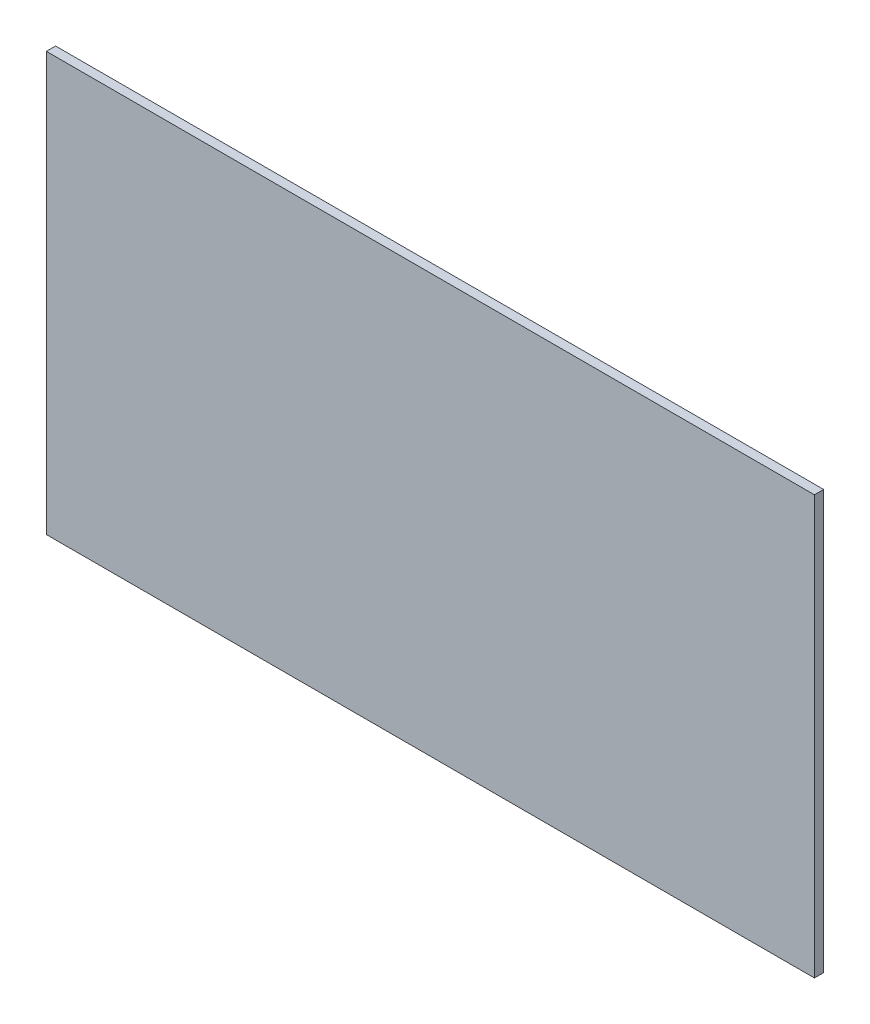
ISO-10303-21;
HEADER;
FILE_DESCRIPTION(('STEP AP214'),'2;1');
FILE_NAME('part.step','',(''),(''),'','','');
FILE_SCHEMA(('AUTOMOTIVE_DESIGN { 1 0 10303 214 1 1 1 1 }'));
ENDSEC;
DATA;
#1=APPLICATION_CONTEXT('core data for automotive mechanical design processes');
#2=APPLICATION_PROTOCOL_DEFINITION('international standard','automotive_design',2000,#1);
#3=PRODUCT_CONTEXT('',#1,'mechanical');
#4=PRODUCT('Part','Part','',(#3));
#5=PRODUCT_RELATED_PRODUCT_CATEGORY('part','',(#4));
#6=PRODUCT_DEFINITION_FORMATION('','',#4);
#7=PRODUCT_DEFINITION_CONTEXT('part definition',#1,'design');
#8=PRODUCT_DEFINITION('design','',#6,#7);
#9=PRODUCT_DEFINITION_SHAPE('','',#8);
#10=(LENGTH_UNIT() NAMED_UNIT(*) SI_UNIT(.MILLI.,.METRE.));
#11=(NAMED_UNIT(*) PLANE_ANGLE_UNIT() SI_UNIT($,.RADIAN.));
#12=(NAMED_UNIT(*) SI_UNIT($,.STERADIAN.) SOLID_ANGLE_UNIT());
#13=UNCERTAINTY_MEASURE_WITH_UNIT(LENGTH_MEASURE(1.E-05),#10,'distance_accuracy_value','');
#14=(GEOMETRIC_REPRESENTATION_CONTEXT(3) GLOBAL_UNCERTAINTY_ASSIGNED_CONTEXT((#13)) GLOBAL_UNIT_ASSIGNED_CONTEXT((#10,
#11,#12)) REPRESENTATION_CONTEXT('',''));
#15=CARTESIAN_POINT('',(0.,0.,0.));
#16=DIRECTION('',(0.,0.,1.));
#17=DIRECTION('',(1.,0.,0.));
#18=AXIS2_PLACEMENT_3D('',#15,#16,#17);
#19=CARTESIAN_POINT('',(0.,0.,1.68));
#20=DIRECTION('',(1.,0.,0.));
#21=DIRECTION('',(0.,0.,-1.));
#22=AXIS2_PLACEMENT_3D('',#19,#20,#21);
#23=PLANE('',#22);
#24=DIRECTION('',(0.,-1.,0.));
#25=VECTOR('',#24,1.);
#26=CARTESIAN_POINT('',(0.,0.,0.));
#27=LINE('',#26,#25);
#28=CARTESIAN_POINT('',(0.,76.28,0.));
#29=VERTEX_POINT('',#28);
#30=CARTESIAN_POINT('',(0.,0.,0.));
#31=VERTEX_POINT('',#30);
#32=EDGE_CURVE('E97',#29,#31,#27,.T.);
#33=ORIENTED_EDGE('',*,*,#32,.T.);
#34=DIRECTION('',(0.,0.,-1.));
#35=VECTOR('',#34,1.);
#36=CARTESIAN_POINT('',(0.,0.,1.68));
#37=LINE('',#36,#35);
#38=CARTESIAN_POINT('',(0.,0.,1.68));
#39=VERTEX_POINT('',#38);
#40=EDGE_CURVE('E11',#39,#31,#37,.T.);
#41=ORIENTED_EDGE('',*,*,#40,.F.);
#42=DIRECTION('',(0.,-1.,0.));
#43=VECTOR('',#42,1.);
#44=CARTESIAN_POINT('',(0.,0.,1.68));
#45=LINE('',#44,#43);
#46=CARTESIAN_POINT('',(0.,76.28,1.68));
#47=VERTEX_POINT('',#46);
#48=EDGE_CURVE('E85',#47,#39,#45,.T.);
#49=ORIENTED_EDGE('',*,*,#48,.F.);
#50=DIRECTION('',(0.,0.,-1.));
#51=VECTOR('',#50,1.);
#52=CARTESIAN_POINT('',(0.,76.28,1.68));
#53=LINE('',#52,#51);
#54=EDGE_CURVE('E93',#47,#29,#53,.T.);
#55=ORIENTED_EDGE('',*,*,#54,.T.);
#56=EDGE_LOOP('',(#33,#41,#49,#55));
#57=FACE_BOUND('',#56,.T.);
#58=ADVANCED_FACE('F34',(#57),#23,.F.);
#59=CARTESIAN_POINT('',(0.,0.,1.68));
#60=DIRECTION('',(0.,1.,0.));
#61=DIRECTION('',(0.,0.,1.));
#62=AXIS2_PLACEMENT_3D('',#59,#60,#61);
#63=PLANE('',#62);
#64=DIRECTION('',(1.,0.,0.));
#65=VECTOR('',#64,1.);
#66=CARTESIAN_POINT('',(0.,0.,0.));
#67=LINE('',#66,#65);
#68=CARTESIAN_POINT('',(140.,0.,0.));
#69=VERTEX_POINT('',#68);
#70=EDGE_CURVE('E89',#31,#69,#67,.T.);
#71=ORIENTED_EDGE('',*,*,#70,.T.);
#72=DIRECTION('',(0.,0.,-1.));
#73=VECTOR('',#72,1.);
#74=CARTESIAN_POINT('',(140.,0.,1.68));
#75=LINE('',#74,#73);
#76=CARTESIAN_POINT('',(140.,0.,1.68));
#77=VERTEX_POINT('',#76);
#78=EDGE_CURVE('E42',#77,#69,#75,.T.);
#79=ORIENTED_EDGE('',*,*,#78,.F.);
#80=DIRECTION('',(1.,0.,0.));
#81=VECTOR('',#80,1.);
#82=CARTESIAN_POINT('',(0.,0.,1.68));
#83=LINE('',#82,#81);
#84=EDGE_CURVE('E80',#39,#77,#83,.T.);
#85=ORIENTED_EDGE('',*,*,#84,.F.);
#86=ORIENTED_EDGE('',*,*,#40,.T.);
#87=EDGE_LOOP('',(#71,#79,#85,#86));
#88=FACE_BOUND('',#87,.T.);
#89=ADVANCED_FACE('F88',(#88),#63,.F.);
#90=CARTESIAN_POINT('',(140.,0.,1.68));
#91=DIRECTION('',(-1.,0.,0.));
#92=DIRECTION('',(0.,0.,1.));
#93=AXIS2_PLACEMENT_3D('',#90,#91,#92);
#94=PLANE('',#93);
#95=DIRECTION('',(0.,1.,0.));
#96=VECTOR('',#95,1.);
#97=CARTESIAN_POINT('',(140.,0.,0.));
#98=LINE('',#97,#96);
#99=CARTESIAN_POINT('',(140.,76.28,0.));
#100=VERTEX_POINT('',#99);
#101=EDGE_CURVE('E67',#69,#100,#98,.T.);
#102=ORIENTED_EDGE('',*,*,#101,.T.);
#103=DIRECTION('',(0.,0.,-1.));
#104=VECTOR('',#103,1.);
#105=CARTESIAN_POINT('',(140.,76.28,1.68));
#106=LINE('',#105,#104);
#107=CARTESIAN_POINT('',(140.,76.28,1.68));
#108=VERTEX_POINT('',#107);
#109=EDGE_CURVE('E90',#108,#100,#106,.T.);
#110=ORIENTED_EDGE('',*,*,#109,.F.);
#111=DIRECTION('',(0.,1.,0.));
#112=VECTOR('',#111,1.);
#113=CARTESIAN_POINT('',(140.,0.,1.68));
#114=LINE('',#113,#112);
#115=EDGE_CURVE('E83',#77,#108,#114,.T.);
#116=ORIENTED_EDGE('',*,*,#115,.F.);
#117=ORIENTED_EDGE('',*,*,#78,.T.);
#118=EDGE_LOOP('',(#102,#110,#116,#117));
#119=FACE_BOUND('',#118,.T.);
#120=ADVANCED_FACE('F91',(#119),#94,.F.);
#121=CARTESIAN_POINT('',(0.,76.28,1.68));
#122=DIRECTION('',(0.,-1.,0.));
#123=DIRECTION('',(0.,0.,-1.));
#124=AXIS2_PLACEMENT_3D('',#121,#122,#123);
#125=PLANE('',#124);
#126=DIRECTION('',(-1.,0.,0.));
#127=VECTOR('',#126,1.);
#128=CARTESIAN_POINT('',(0.,76.28,0.));
#129=LINE('',#128,#127);
#130=EDGE_CURVE('E73',#100,#29,#129,.T.);
#131=ORIENTED_EDGE('',*,*,#130,.T.);
#132=ORIENTED_EDGE('',*,*,#54,.F.);
#133=DIRECTION('',(-1.,0.,0.));
#134=VECTOR('',#133,1.);
#135=CARTESIAN_POINT('',(0.,76.28,1.68));
#136=LINE('',#135,#134);
#137=EDGE_CURVE('E50',#108,#47,#136,.T.);
#138=ORIENTED_EDGE('',*,*,#137,.F.);
#139=ORIENTED_EDGE('',*,*,#109,.T.);
#140=EDGE_LOOP('',(#131,#132,#138,#139));
#141=FACE_BOUND('',#140,.T.);
#142=ADVANCED_FACE('F104',(#141),#125,.F.);
#143=CARTESIAN_POINT('',(0.,0.,1.68));
#144=DIRECTION('',(0.,0.,-1.));
#145=DIRECTION('',(-1.,0.,0.));
#146=AXIS2_PLACEMENT_3D('',#143,#144,#145);
#147=PLANE('',#146);
#148=ORIENTED_EDGE('',*,*,#48,.T.);
#149=ORIENTED_EDGE('',*,*,#84,.T.);
#150=ORIENTED_EDGE('',*,*,#115,.T.);
#151=ORIENTED_EDGE('',*,*,#137,.T.);
#152=EDGE_LOOP('',(#148,#149,#150,#151));
#153=FACE_BOUND('',#152,.T.);
#154=ADVANCED_FACE('F81',(#153),#147,.F.);
#155=CARTESIAN_POINT('',(0.,0.,0.));
#156=DIRECTION('',(0.,0.,-1.));
#157=DIRECTION('',(-1.,0.,0.));
#158=AXIS2_PLACEMENT_3D('',#155,#156,#157);
#159=PLANE('',#158);
#160=ORIENTED_EDGE('',*,*,#32,.F.);
#161=ORIENTED_EDGE('',*,*,#130,.F.);
#162=ORIENTED_EDGE('',*,*,#101,.F.);
#163=ORIENTED_EDGE('',*,*,#70,.F.);
#164=EDGE_LOOP('',(#160,#161,#162,#163));
#165=FACE_BOUND('',#164,.T.);
#166=ADVANCED_FACE('F107',(#165),#159,.T.);
#167=CLOSED_SHELL('',(#58,#89,#120,#142,#154,#166));
#168=MANIFOLD_SOLID_BREP('B2',#167);
#169=ADVANCED_BREP_SHAPE_REPRESENTATION('',(#18,#168),#14);
#170=SHAPE_DEFINITION_REPRESENTATION(#9,#169);
ENDSEC;
END-ISO-10303-21;
